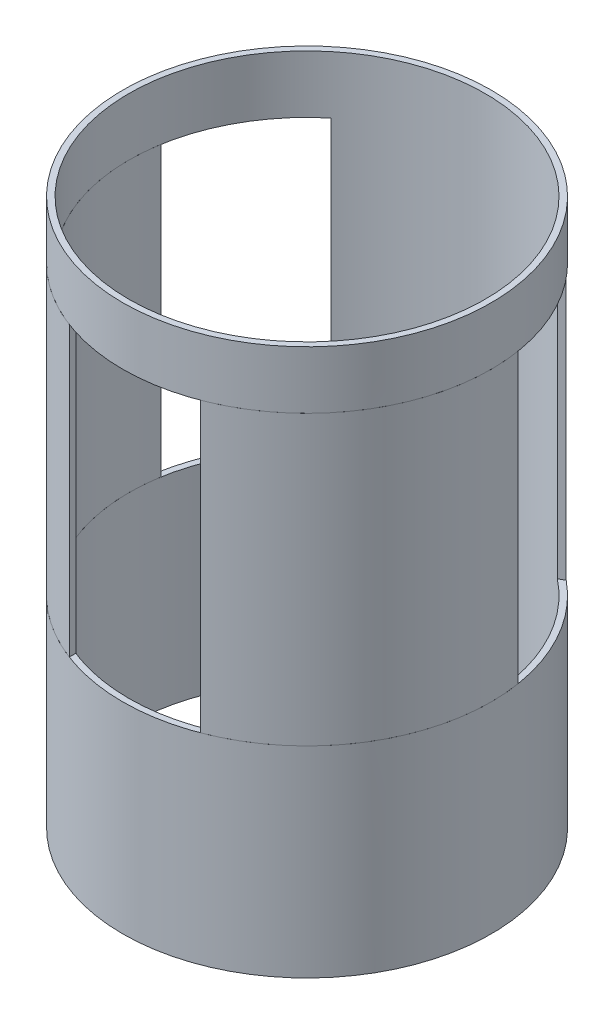
ISO-10303-21;
HEADER;
FILE_DESCRIPTION(('STEP AP214'),'2;1');
FILE_NAME('part.step','',(''),(''),'','','');
FILE_SCHEMA(('AUTOMOTIVE_DESIGN { 1 0 10303 214 1 1 1 1 }'));
ENDSEC;
DATA;
#1=APPLICATION_CONTEXT('core data for automotive mechanical design processes');
#2=APPLICATION_PROTOCOL_DEFINITION('international standard','automotive_design',2000,#1);
#3=PRODUCT_CONTEXT('',#1,'mechanical');
#4=PRODUCT('Part','Part','',(#3));
#5=PRODUCT_RELATED_PRODUCT_CATEGORY('part','',(#4));
#6=PRODUCT_DEFINITION_FORMATION('','',#4);
#7=PRODUCT_DEFINITION_CONTEXT('part definition',#1,'design');
#8=PRODUCT_DEFINITION('design','',#6,#7);
#9=PRODUCT_DEFINITION_SHAPE('','',#8);
#10=(LENGTH_UNIT() NAMED_UNIT(*) SI_UNIT(.MILLI.,.METRE.));
#11=(NAMED_UNIT(*) PLANE_ANGLE_UNIT() SI_UNIT($,.RADIAN.));
#12=(NAMED_UNIT(*) SI_UNIT($,.STERADIAN.) SOLID_ANGLE_UNIT());
#13=UNCERTAINTY_MEASURE_WITH_UNIT(LENGTH_MEASURE(1.E-05),#10,'distance_accuracy_value','');
#14=(GEOMETRIC_REPRESENTATION_CONTEXT(3) GLOBAL_UNCERTAINTY_ASSIGNED_CONTEXT((#13)) GLOBAL_UNIT_ASSIGNED_CONTEXT((#10,
#11,#12)) REPRESENTATION_CONTEXT('',''));
#15=CARTESIAN_POINT('',(0.,0.,0.));
#16=DIRECTION('',(0.,0.,1.));
#17=DIRECTION('',(1.,0.,0.));
#18=AXIS2_PLACEMENT_3D('',#15,#16,#17);
#19=CARTESIAN_POINT('',(0.,107.5,0.));
#20=DIRECTION('',(0.,-1.,0.));
#21=DIRECTION('',(0.,0.,-1.));
#22=AXIS2_PLACEMENT_3D('',#19,#20,#21);
#23=CYLINDRICAL_SURFACE('',#22,66.5);
#24=CARTESIAN_POINT('',(0.,0.,0.));
#25=DIRECTION('',(0.,1.,0.));
#26=DIRECTION('',(0.,0.,1.));
#27=AXIS2_PLACEMENT_3D('',#24,#25,#26);
#28=CIRCLE('',#27,66.5);
#29=CARTESIAN_POINT('',(-65.5808484364172,0.,-11.0182720224032));
#30=VERTEX_POINT('',#29);
#31=CARTESIAN_POINT('',(-24.4719165694739,0.,61.8334480634608));
#32=VERTEX_POINT('',#31);
#33=EDGE_CURVE('E125',#30,#32,#28,.T.);
#34=ORIENTED_EDGE('',*,*,#33,.F.);
#35=DIRECTION('',(0.,-1.,0.));
#36=VECTOR('',#35,1.);
#37=CARTESIAN_POINT('',(-65.5808484364172,107.5,-11.0182720224032));
#38=LINE('',#37,#36);
#39=CARTESIAN_POINT('',(-65.5808484364172,107.5,-11.0182720224032));
#40=VERTEX_POINT('',#39);
#41=EDGE_CURVE('E13',#40,#30,#38,.T.);
#42=ORIENTED_EDGE('',*,*,#41,.F.);
#43=CARTESIAN_POINT('',(0.,107.5,0.));
#44=DIRECTION('',(0.,1.,0.));
#45=DIRECTION('',(0.,0.,1.));
#46=AXIS2_PLACEMENT_3D('',#43,#44,#45);
#47=CIRCLE('',#46,66.5);
#48=CARTESIAN_POINT('',(-24.4719165694739,107.5,61.8334480634608));
#49=VERTEX_POINT('',#48);
#50=EDGE_CURVE('E119',#40,#49,#47,.T.);
#51=ORIENTED_EDGE('',*,*,#50,.T.);
#52=DIRECTION('',(0.,-1.,0.));
#53=VECTOR('',#52,1.);
#54=CARTESIAN_POINT('',(-24.4719165694739,107.5,61.8334480634608));
#55=LINE('',#54,#53);
#56=EDGE_CURVE('E100',#49,#32,#55,.T.);
#57=ORIENTED_EDGE('',*,*,#56,.T.);
#58=EDGE_LOOP('',(#34,#42,#51,#57));
#59=FACE_BOUND('',#58,.T.);
#60=ADVANCED_FACE('F62',(#59),#23,.F.);
#61=CARTESIAN_POINT('',(0.,107.5,0.));
#62=DIRECTION('',(0.16568830108877,0.,-0.986178171976199));
#63=DIRECTION('',(-0.986178171976199,0.,-0.16568830108877));
#64=AXIS2_PLACEMENT_3D('',#61,#62,#63);
#65=PLANE('',#64);
#66=DIRECTION('',(0.986178171976199,0.,0.16568830108877));
#67=VECTOR('',#66,1.);
#68=CARTESIAN_POINT('',(0.,0.,0.));
#69=LINE('',#68,#67);
#70=CARTESIAN_POINT('',(-67.7997493233637,0.,-11.3910706998529));
#71=VERTEX_POINT('',#70);
#72=EDGE_CURVE('E113',#71,#30,#69,.T.);
#73=ORIENTED_EDGE('',*,*,#72,.F.);
#74=DIRECTION('',(0.,-1.,0.));
#75=VECTOR('',#74,1.);
#76=CARTESIAN_POINT('',(-67.7997493233637,107.5,-11.3910706998529));
#77=LINE('',#76,#75);
#78=CARTESIAN_POINT('',(-67.7997493233637,107.5,-11.3910706998529));
#79=VERTEX_POINT('',#78);
#80=EDGE_CURVE('E70',#79,#71,#77,.T.);
#81=ORIENTED_EDGE('',*,*,#80,.F.);
#82=DIRECTION('',(0.986178171976199,0.,0.16568830108877));
#83=VECTOR('',#82,1.);
#84=CARTESIAN_POINT('',(0.,107.5,0.));
#85=LINE('',#84,#83);
#86=EDGE_CURVE('E111',#79,#40,#85,.T.);
#87=ORIENTED_EDGE('',*,*,#86,.T.);
#88=ORIENTED_EDGE('',*,*,#41,.T.);
#89=EDGE_LOOP('',(#73,#81,#87,#88));
#90=FACE_BOUND('',#89,.T.);
#91=ADVANCED_FACE('F109',(#90),#65,.T.);
#92=CARTESIAN_POINT('',(0.,107.5,0.));
#93=DIRECTION('',(0.,-1.,0.));
#94=DIRECTION('',(0.,0.,-1.));
#95=AXIS2_PLACEMENT_3D('',#92,#93,#94);
#96=CYLINDRICAL_SURFACE('',#95,68.75);
#97=CARTESIAN_POINT('',(0.,0.,0.));
#98=DIRECTION('',(0.,1.,0.));
#99=DIRECTION('',(0.,0.,1.));
#100=AXIS2_PLACEMENT_3D('',#97,#98,#99);
#101=CIRCLE('',#100,68.75);
#102=CARTESIAN_POINT('',(-24.4719165694739,0.,64.2470839759806));
#103=VERTEX_POINT('',#102);
#104=EDGE_CURVE('E93',#71,#103,#101,.T.);
#105=ORIENTED_EDGE('',*,*,#104,.T.);
#106=DIRECTION('',(0.,-1.,0.));
#107=VECTOR('',#106,1.);
#108=CARTESIAN_POINT('',(-24.4719165694739,107.5,64.2470839759806));
#109=LINE('',#108,#107);
#110=CARTESIAN_POINT('',(-24.4719165694739,107.5,64.2470839759806));
#111=VERTEX_POINT('',#110);
#112=EDGE_CURVE('E114',#111,#103,#109,.T.);
#113=ORIENTED_EDGE('',*,*,#112,.F.);
#114=CARTESIAN_POINT('',(0.,107.5,0.));
#115=DIRECTION('',(0.,1.,0.));
#116=DIRECTION('',(0.,0.,1.));
#117=AXIS2_PLACEMENT_3D('',#114,#115,#116);
#118=CIRCLE('',#117,68.75);
#119=EDGE_CURVE('E115',#79,#111,#118,.T.);
#120=ORIENTED_EDGE('',*,*,#119,.F.);
#121=ORIENTED_EDGE('',*,*,#80,.T.);
#122=EDGE_LOOP('',(#105,#113,#120,#121));
#123=FACE_BOUND('',#122,.T.);
#124=ADVANCED_FACE('F116',(#123),#96,.T.);
#125=CARTESIAN_POINT('',(-24.4719165694739,107.5,0.));
#126=DIRECTION('',(-1.,0.,0.));
#127=DIRECTION('',(0.,0.,1.));
#128=AXIS2_PLACEMENT_3D('',#125,#126,#127);
#129=PLANE('',#128);
#130=DIRECTION('',(0.,0.,-1.));
#131=VECTOR('',#130,1.);
#132=CARTESIAN_POINT('',(-24.4719165694739,0.,0.));
#133=LINE('',#132,#131);
#134=EDGE_CURVE('E121',#103,#32,#133,.T.);
#135=ORIENTED_EDGE('',*,*,#134,.T.);
#136=ORIENTED_EDGE('',*,*,#56,.F.);
#137=DIRECTION('',(0.,0.,-1.));
#138=VECTOR('',#137,1.);
#139=CARTESIAN_POINT('',(-24.4719165694739,107.5,0.));
#140=LINE('',#139,#138);
#141=EDGE_CURVE('E78',#111,#49,#140,.T.);
#142=ORIENTED_EDGE('',*,*,#141,.F.);
#143=ORIENTED_EDGE('',*,*,#112,.T.);
#144=EDGE_LOOP('',(#135,#136,#142,#143));
#145=FACE_BOUND('',#144,.T.);
#146=ADVANCED_FACE('F134',(#145),#129,.F.);
#147=CARTESIAN_POINT('',(0.,107.5,0.));
#148=DIRECTION('',(0.,1.,0.));
#149=DIRECTION('',(0.,0.,1.));
#150=AXIS2_PLACEMENT_3D('',#147,#148,#149);
#151=PLANE('',#150);
#152=ORIENTED_EDGE('',*,*,#50,.F.);
#153=ORIENTED_EDGE('',*,*,#86,.F.);
#154=ORIENTED_EDGE('',*,*,#119,.T.);
#155=ORIENTED_EDGE('',*,*,#141,.T.);
#156=EDGE_LOOP('',(#152,#153,#154,#155));
#157=FACE_BOUND('',#156,.T.);
#158=ADVANCED_FACE('F118',(#157),#151,.T.);
#159=CARTESIAN_POINT('',(0.,0.,0.));
#160=DIRECTION('',(0.,1.,0.));
#161=DIRECTION('',(0.,0.,1.));
#162=AXIS2_PLACEMENT_3D('',#159,#160,#161);
#163=PLANE('',#162);
#164=ORIENTED_EDGE('',*,*,#33,.T.);
#165=ORIENTED_EDGE('',*,*,#134,.F.);
#166=ORIENTED_EDGE('',*,*,#104,.F.);
#167=ORIENTED_EDGE('',*,*,#72,.T.);
#168=EDGE_LOOP('',(#164,#165,#166,#167));
#169=FACE_BOUND('',#168,.T.);
#170=ADVANCED_FACE('F136',(#169),#163,.F.);
#171=CLOSED_SHELL('',(#60,#91,#124,#146,#158,#170));
#172=MANIFOLD_SOLID_BREP('B2',#171);
#173=CARTESIAN_POINT('',(0.,107.5,0.));
#174=DIRECTION('',(0.,-1.,0.));
#175=DIRECTION('',(0.,0.,-1.));
#176=AXIS2_PLACEMENT_3D('',#173,#174,#175);
#177=CYLINDRICAL_SURFACE('',#176,66.5);
#178=CARTESIAN_POINT('',(0.,0.,0.));
#179=DIRECTION('',(0.,1.,0.));
#180=DIRECTION('',(0.,0.,1.));
#181=AXIS2_PLACEMENT_3D('',#178,#179,#180);
#182=CIRCLE('',#181,66.5);
#183=CARTESIAN_POINT('',(24.4719165694739,0.,61.8334480634608));
#184=VERTEX_POINT('',#183);
#185=CARTESIAN_POINT('',(65.7852951112797,0.,-9.72342260327268));
#186=VERTEX_POINT('',#185);
#187=EDGE_CURVE('E276',#184,#186,#182,.T.);
#188=ORIENTED_EDGE('',*,*,#187,.F.);
#189=DIRECTION('',(0.,-1.,0.));
#190=VECTOR('',#189,1.);
#191=CARTESIAN_POINT('',(24.4719165694739,107.5,61.8334480634608));
#192=LINE('',#191,#190);
#193=CARTESIAN_POINT('',(24.4719165694739,107.5,61.8334480634608));
#194=VERTEX_POINT('',#193);
#195=EDGE_CURVE('E60',#194,#184,#192,.T.);
#196=ORIENTED_EDGE('',*,*,#195,.F.);
#197=CARTESIAN_POINT('',(0.,107.5,0.));
#198=DIRECTION('',(0.,1.,0.));
#199=DIRECTION('',(0.,0.,1.));
#200=AXIS2_PLACEMENT_3D('',#197,#198,#199);
#201=CIRCLE('',#200,66.5);
#202=CARTESIAN_POINT('',(65.7852951112797,107.5,-9.72342260327268));
#203=VERTEX_POINT('',#202);
#204=EDGE_CURVE('E270',#194,#203,#201,.T.);
#205=ORIENTED_EDGE('',*,*,#204,.T.);
#206=DIRECTION('',(0.,-1.,0.));
#207=VECTOR('',#206,1.);
#208=CARTESIAN_POINT('',(65.7852951112797,107.5,-9.72342260327268));
#209=LINE('',#208,#207);
#210=EDGE_CURVE('E251',#203,#186,#209,.T.);
#211=ORIENTED_EDGE('',*,*,#210,.T.);
#212=EDGE_LOOP('',(#188,#196,#205,#211));
#213=FACE_BOUND('',#212,.T.);
#214=ADVANCED_FACE('F213',(#213),#177,.F.);
#215=CARTESIAN_POINT('',(24.471916569474,107.5,0.));
#216=DIRECTION('',(-1.,0.,0.));
#217=DIRECTION('',(0.,0.,1.));
#218=AXIS2_PLACEMENT_3D('',#215,#216,#217);
#219=PLANE('',#218);
#220=DIRECTION('',(0.,0.,-1.));
#221=VECTOR('',#220,1.);
#222=CARTESIAN_POINT('',(24.471916569474,0.,0.));
#223=LINE('',#222,#221);
#224=CARTESIAN_POINT('',(24.4719165694739,0.,64.2470839759806));
#225=VERTEX_POINT('',#224);
#226=EDGE_CURVE('E264',#225,#184,#223,.T.);
#227=ORIENTED_EDGE('',*,*,#226,.F.);
#228=DIRECTION('',(0.,-1.,0.));
#229=VECTOR('',#228,1.);
#230=CARTESIAN_POINT('',(24.4719165694739,107.5,64.2470839759806));
#231=LINE('',#230,#229);
#232=CARTESIAN_POINT('',(24.4719165694739,107.5,64.2470839759806));
#233=VERTEX_POINT('',#232);
#234=EDGE_CURVE('E221',#233,#225,#231,.T.);
#235=ORIENTED_EDGE('',*,*,#234,.F.);
#236=DIRECTION('',(0.,0.,-1.));
#237=VECTOR('',#236,1.);
#238=CARTESIAN_POINT('',(24.471916569474,107.5,0.));
#239=LINE('',#238,#237);
#240=EDGE_CURVE('E262',#233,#194,#239,.T.);
#241=ORIENTED_EDGE('',*,*,#240,.T.);
#242=ORIENTED_EDGE('',*,*,#195,.T.);
#243=EDGE_LOOP('',(#227,#235,#241,#242));
#244=FACE_BOUND('',#243,.T.);
#245=ADVANCED_FACE('F260',(#244),#219,.T.);
#246=CARTESIAN_POINT('',(0.,107.5,0.));
#247=DIRECTION('',(0.,-1.,0.));
#248=DIRECTION('',(0.,0.,-1.));
#249=AXIS2_PLACEMENT_3D('',#246,#247,#248);
#250=CYLINDRICAL_SURFACE('',#249,68.75);
#251=CARTESIAN_POINT('',(0.,0.,0.));
#252=DIRECTION('',(0.,1.,0.));
#253=DIRECTION('',(0.,0.,1.));
#254=AXIS2_PLACEMENT_3D('',#251,#252,#253);
#255=CIRCLE('',#254,68.75);
#256=CARTESIAN_POINT('',(67.8755651270083,0.,-10.9302405595325));
#257=VERTEX_POINT('',#256);
#258=EDGE_CURVE('E244',#225,#257,#255,.T.);
#259=ORIENTED_EDGE('',*,*,#258,.T.);
#260=DIRECTION('',(0.,-1.,0.));
#261=VECTOR('',#260,1.);
#262=CARTESIAN_POINT('',(67.8755651270083,107.5,-10.9302405595325));
#263=LINE('',#262,#261);
#264=CARTESIAN_POINT('',(67.8755651270083,107.5,-10.9302405595325));
#265=VERTEX_POINT('',#264);
#266=EDGE_CURVE('E265',#265,#257,#263,.T.);
#267=ORIENTED_EDGE('',*,*,#266,.F.);
#268=CARTESIAN_POINT('',(0.,107.5,0.));
#269=DIRECTION('',(0.,1.,0.));
#270=DIRECTION('',(0.,0.,1.));
#271=AXIS2_PLACEMENT_3D('',#268,#269,#270);
#272=CIRCLE('',#271,68.75);
#273=EDGE_CURVE('E266',#233,#265,#272,.T.);
#274=ORIENTED_EDGE('',*,*,#273,.F.);
#275=ORIENTED_EDGE('',*,*,#234,.T.);
#276=EDGE_LOOP('',(#259,#267,#274,#275));
#277=FACE_BOUND('',#276,.T.);
#278=ADVANCED_FACE('F267',(#277),#250,.T.);
#279=CARTESIAN_POINT('',(12.235958284737,107.5,21.1933014284577));
#280=DIRECTION('',(0.5,0.,0.866025403784439));
#281=DIRECTION('',(0.866025403784439,0.,-0.5));
#282=AXIS2_PLACEMENT_3D('',#279,#280,#281);
#283=PLANE('',#282);
#284=DIRECTION('',(-0.866025403784439,0.,0.5));
#285=VECTOR('',#284,1.);
#286=CARTESIAN_POINT('',(12.235958284737,0.,21.1933014284577));
#287=LINE('',#286,#285);
#288=EDGE_CURVE('E272',#257,#186,#287,.T.);
#289=ORIENTED_EDGE('',*,*,#288,.T.);
#290=ORIENTED_EDGE('',*,*,#210,.F.);
#291=DIRECTION('',(-0.866025403784439,0.,0.5));
#292=VECTOR('',#291,1.);
#293=CARTESIAN_POINT('',(12.235958284737,107.5,21.1933014284577));
#294=LINE('',#293,#292);
#295=EDGE_CURVE('E229',#265,#203,#294,.T.);
#296=ORIENTED_EDGE('',*,*,#295,.F.);
#297=ORIENTED_EDGE('',*,*,#266,.T.);
#298=EDGE_LOOP('',(#289,#290,#296,#297));
#299=FACE_BOUND('',#298,.T.);
#300=ADVANCED_FACE('F285',(#299),#283,.F.);
#301=CARTESIAN_POINT('',(0.,107.5,0.));
#302=DIRECTION('',(0.,1.,0.));
#303=DIRECTION('',(0.,0.,1.));
#304=AXIS2_PLACEMENT_3D('',#301,#302,#303);
#305=PLANE('',#304);
#306=ORIENTED_EDGE('',*,*,#204,.F.);
#307=ORIENTED_EDGE('',*,*,#240,.F.);
#308=ORIENTED_EDGE('',*,*,#273,.T.);
#309=ORIENTED_EDGE('',*,*,#295,.T.);
#310=EDGE_LOOP('',(#306,#307,#308,#309));
#311=FACE_BOUND('',#310,.T.);
#312=ADVANCED_FACE('F269',(#311),#305,.T.);
#313=CARTESIAN_POINT('',(0.,0.,0.));
#314=DIRECTION('',(0.,1.,0.));
#315=DIRECTION('',(0.,0.,1.));
#316=AXIS2_PLACEMENT_3D('',#313,#314,#315);
#317=PLANE('',#316);
#318=ORIENTED_EDGE('',*,*,#187,.T.);
#319=ORIENTED_EDGE('',*,*,#288,.F.);
#320=ORIENTED_EDGE('',*,*,#258,.F.);
#321=ORIENTED_EDGE('',*,*,#226,.T.);
#322=EDGE_LOOP('',(#318,#319,#320,#321));
#323=FACE_BOUND('',#322,.T.);
#324=ADVANCED_FACE('F287',(#323),#317,.F.);
#325=CLOSED_SHELL('',(#214,#245,#278,#300,#312,#324));
#326=MANIFOLD_SOLID_BREP('B7',#325);
#327=CARTESIAN_POINT('',(0.,107.5,0.));
#328=DIRECTION('',(0.,-1.,0.));
#329=DIRECTION('',(0.,0.,-1.));
#330=AXIS2_PLACEMENT_3D('',#327,#328,#329);
#331=CYLINDRICAL_SURFACE('',#330,66.5);
#332=DIRECTION('',(0.,-1.,0.));
#333=VECTOR('',#332,1.);
#334=CARTESIAN_POINT('',(-42.332527695417,107.5,-51.2855447364728));
#335=LINE('',#334,#333);
#336=CARTESIAN_POINT('',(-42.332527695417,107.5,-51.2855447364728));
#337=VERTEX_POINT('',#336);
#338=CARTESIAN_POINT('',(-42.332527695417,0.,-51.2855447364728));
#339=VERTEX_POINT('',#338);
#340=EDGE_CURVE('E385',#337,#339,#335,.T.);
#341=ORIENTED_EDGE('',*,*,#340,.T.);
#342=CARTESIAN_POINT('',(0.,0.,0.));
#343=DIRECTION('',(0.,1.,0.));
#344=DIRECTION('',(0.,0.,1.));
#345=AXIS2_PLACEMENT_3D('',#342,#343,#344);
#346=CIRCLE('',#345,66.5);
#347=CARTESIAN_POINT('',(41.3133785418058,0.,-52.1100254601882));
#348=VERTEX_POINT('',#347);
#349=EDGE_CURVE('E403',#339,#348,#346,.T.);
#350=ORIENTED_EDGE('',*,*,#349,.T.);
#351=DIRECTION('',(0.,-1.,0.));
#352=VECTOR('',#351,1.);
#353=CARTESIAN_POINT('',(41.3133785418058,107.5,-52.1100254601882));
#354=LINE('',#353,#352);
#355=CARTESIAN_POINT('',(41.3133785418058,107.5,-52.1100254601882));
#356=VERTEX_POINT('',#355);
#357=EDGE_CURVE('E211',#356,#348,#354,.T.);
#358=ORIENTED_EDGE('',*,*,#357,.F.);
#359=CARTESIAN_POINT('',(0.,107.5,0.));
#360=DIRECTION('',(0.,1.,0.));
#361=DIRECTION('',(0.,0.,1.));
#362=AXIS2_PLACEMENT_3D('',#359,#360,#361);
#363=CIRCLE('',#362,66.5);
#364=EDGE_CURVE('E426',#337,#356,#363,.T.);
#365=ORIENTED_EDGE('',*,*,#364,.F.);
#366=EDGE_LOOP('',(#341,#350,#358,#365));
#367=FACE_BOUND('',#366,.T.);
#368=CARTESIAN_POINT('',(0.,129.,0.));
#369=DIRECTION('',(0.,1.,0.));
#370=DIRECTION('',(0.,0.,1.));
#371=AXIS2_PLACEMENT_3D('',#368,#369,#370);
#372=CIRCLE('',#371,66.5);
#373=CARTESIAN_POINT('',(0.,129.,66.5));
#374=VERTEX_POINT('',#373);
#375=EDGE_CURVE('E421',#374,#374,#372,.T.);
#376=ORIENTED_EDGE('',*,*,#375,.T.);
#377=EDGE_LOOP('',(#376));
#378=FACE_BOUND('',#377,.T.);
#379=CARTESIAN_POINT('',(0.,-75.,0.));
#380=DIRECTION('',(0.,1.,0.));
#381=DIRECTION('',(0.,0.,1.));
#382=AXIS2_PLACEMENT_3D('',#379,#380,#381);
#383=CIRCLE('',#382,66.5);
#384=CARTESIAN_POINT('',(0.,-75.,66.5));
#385=VERTEX_POINT('',#384);
#386=EDGE_CURVE('E416',#385,#385,#383,.T.);
#387=ORIENTED_EDGE('',*,*,#386,.F.);
#388=EDGE_LOOP('',(#387));
#389=FACE_BOUND('',#388,.T.);
#390=ADVANCED_FACE('F349',(#367,#378,#389),#331,.F.);
#391=CARTESIAN_POINT('',(-12.235958284737,107.5,-21.1933014284577));
#392=DIRECTION('',(0.500000000000001,0.,0.866025403784438));
#393=DIRECTION('',(0.866025403784438,0.,-0.500000000000001));
#394=AXIS2_PLACEMENT_3D('',#391,#392,#393);
#395=PLANE('',#394);
#396=DIRECTION('',(-0.866025403784438,0.,0.500000000000001));
#397=VECTOR('',#396,1.);
#398=CARTESIAN_POINT('',(-12.235958284737,0.,-21.1933014284577));
#399=LINE('',#398,#397);
#400=CARTESIAN_POINT('',(43.4036485575344,0.,-53.3168434164481));
#401=VERTEX_POINT('',#400);
#402=EDGE_CURVE('E395',#401,#348,#399,.T.);
#403=ORIENTED_EDGE('',*,*,#402,.F.);
#404=DIRECTION('',(0.,-1.,0.));
#405=VECTOR('',#404,1.);
#406=CARTESIAN_POINT('',(43.4036485575344,107.5,-53.3168434164481));
#407=LINE('',#406,#405);
#408=CARTESIAN_POINT('',(43.4036485575344,107.5,-53.3168434164481));
#409=VERTEX_POINT('',#408);
#410=EDGE_CURVE('E358',#409,#401,#407,.T.);
#411=ORIENTED_EDGE('',*,*,#410,.F.);
#412=DIRECTION('',(-0.866025403784438,0.,0.500000000000001));
#413=VECTOR('',#412,1.);
#414=CARTESIAN_POINT('',(-12.235958284737,107.5,-21.1933014284577));
#415=LINE('',#414,#413);
#416=EDGE_CURVE('E398',#409,#356,#415,.T.);
#417=ORIENTED_EDGE('',*,*,#416,.T.);
#418=ORIENTED_EDGE('',*,*,#357,.T.);
#419=EDGE_LOOP('',(#403,#411,#417,#418));
#420=FACE_BOUND('',#419,.T.);
#421=ADVANCED_FACE('F394',(#420),#395,.T.);
#422=CARTESIAN_POINT('',(0.,107.5,0.));
#423=DIRECTION('',(0.,-1.,0.));
#424=DIRECTION('',(0.,0.,-1.));
#425=AXIS2_PLACEMENT_3D('',#422,#423,#424);
#426=CYLINDRICAL_SURFACE('',#425,68.75);
#427=ORIENTED_EDGE('',*,*,#410,.T.);
#428=CARTESIAN_POINT('',(0.,0.,0.));
#429=DIRECTION('',(0.,1.,0.));
#430=DIRECTION('',(0.,0.,1.));
#431=AXIS2_PLACEMENT_3D('',#428,#429,#430);
#432=CIRCLE('',#431,68.75);
#433=CARTESIAN_POINT('',(-43.7648312640589,0.,-53.0207699343234));
#434=VERTEX_POINT('',#433);
#435=EDGE_CURVE('E404',#434,#401,#432,.T.);
#436=ORIENTED_EDGE('',*,*,#435,.F.);
#437=DIRECTION('',(0.,-1.,0.));
#438=VECTOR('',#437,1.);
#439=CARTESIAN_POINT('',(-43.7648312640589,107.5,-53.0207699343234));
#440=LINE('',#439,#438);
#441=CARTESIAN_POINT('',(-43.7648312640589,107.5,-53.0207699343234));
#442=VERTEX_POINT('',#441);
#443=EDGE_CURVE('E366',#442,#434,#440,.T.);
#444=ORIENTED_EDGE('',*,*,#443,.F.);
#445=CARTESIAN_POINT('',(0.,107.5,0.));
#446=DIRECTION('',(0.,1.,0.));
#447=DIRECTION('',(0.,0.,1.));
#448=AXIS2_PLACEMENT_3D('',#445,#446,#447);
#449=CIRCLE('',#448,68.75);
#450=EDGE_CURVE('E425',#442,#409,#449,.T.);
#451=ORIENTED_EDGE('',*,*,#450,.T.);
#452=EDGE_LOOP('',(#427,#436,#444,#451));
#453=FACE_BOUND('',#452,.T.);
#454=CARTESIAN_POINT('',(0.,129.,0.));
#455=DIRECTION('',(0.,1.,0.));
#456=DIRECTION('',(0.,0.,1.));
#457=AXIS2_PLACEMENT_3D('',#454,#455,#456);
#458=CIRCLE('',#457,68.75);
#459=CARTESIAN_POINT('',(0.,129.,68.75));
#460=VERTEX_POINT('',#459);
#461=EDGE_CURVE('E407',#460,#460,#458,.T.);
#462=ORIENTED_EDGE('',*,*,#461,.F.);
#463=EDGE_LOOP('',(#462));
#464=FACE_BOUND('',#463,.T.);
#465=CARTESIAN_POINT('',(0.,-75.,0.));
#466=DIRECTION('',(0.,1.,0.));
#467=DIRECTION('',(0.,0.,1.));
#468=AXIS2_PLACEMENT_3D('',#465,#466,#467);
#469=CIRCLE('',#468,68.75);
#470=CARTESIAN_POINT('',(0.,-75.,68.75));
#471=VERTEX_POINT('',#470);
#472=EDGE_CURVE('E411',#471,#471,#469,.T.);
#473=ORIENTED_EDGE('',*,*,#472,.T.);
#474=EDGE_LOOP('',(#473));
#475=FACE_BOUND('',#474,.T.);
#476=ADVANCED_FACE('F446',(#453,#464,#475),#426,.T.);
#477=CARTESIAN_POINT('',(0.,107.5,0.));
#478=DIRECTION('',(0.771211199044705,0.,-0.636579363840856));
#479=DIRECTION('',(-0.636579363840856,0.,-0.771211199044705));
#480=AXIS2_PLACEMENT_3D('',#477,#478,#479);
#481=PLANE('',#480);
#482=DIRECTION('',(0.636579363840856,0.,0.771211199044705));
#483=VECTOR('',#482,1.);
#484=CARTESIAN_POINT('',(0.,0.,0.));
#485=LINE('',#484,#483);
#486=EDGE_CURVE('E406',#434,#339,#485,.T.);
#487=ORIENTED_EDGE('',*,*,#486,.T.);
#488=ORIENTED_EDGE('',*,*,#340,.F.);
#489=DIRECTION('',(0.636579363840856,0.,0.771211199044705));
#490=VECTOR('',#489,1.);
#491=CARTESIAN_POINT('',(0.,107.5,0.));
#492=LINE('',#491,#490);
#493=EDGE_CURVE('E436',#442,#337,#492,.T.);
#494=ORIENTED_EDGE('',*,*,#493,.F.);
#495=ORIENTED_EDGE('',*,*,#443,.T.);
#496=EDGE_LOOP('',(#487,#488,#494,#495));
#497=FACE_BOUND('',#496,.T.);
#498=ADVANCED_FACE('F451',(#497),#481,.F.);
#499=CARTESIAN_POINT('',(0.,129.,0.));
#500=DIRECTION('',(0.,1.,0.));
#501=DIRECTION('',(0.,0.,1.));
#502=AXIS2_PLACEMENT_3D('',#499,#500,#501);
#503=PLANE('',#502);
#504=ORIENTED_EDGE('',*,*,#461,.T.);
#505=EDGE_LOOP('',(#504));
#506=FACE_BOUND('',#505,.T.);
#507=ORIENTED_EDGE('',*,*,#375,.F.);
#508=EDGE_LOOP('',(#507));
#509=FACE_BOUND('',#508,.T.);
#510=ADVANCED_FACE('F453',(#506,#509),#503,.T.);
#511=CARTESIAN_POINT('',(0.,107.5,0.));
#512=DIRECTION('',(0.,1.,0.));
#513=DIRECTION('',(0.,0.,1.));
#514=AXIS2_PLACEMENT_3D('',#511,#512,#513);
#515=PLANE('',#514);
#516=ORIENTED_EDGE('',*,*,#416,.F.);
#517=ORIENTED_EDGE('',*,*,#450,.F.);
#518=ORIENTED_EDGE('',*,*,#493,.T.);
#519=ORIENTED_EDGE('',*,*,#364,.T.);
#520=EDGE_LOOP('',(#516,#517,#518,#519));
#521=FACE_BOUND('',#520,.T.);
#522=ADVANCED_FACE('F450',(#521),#515,.F.);
#523=CARTESIAN_POINT('',(0.,0.,0.));
#524=DIRECTION('',(0.,1.,0.));
#525=DIRECTION('',(0.,0.,1.));
#526=AXIS2_PLACEMENT_3D('',#523,#524,#525);
#527=PLANE('',#526);
#528=ORIENTED_EDGE('',*,*,#486,.F.);
#529=ORIENTED_EDGE('',*,*,#435,.T.);
#530=ORIENTED_EDGE('',*,*,#402,.T.);
#531=ORIENTED_EDGE('',*,*,#349,.F.);
#532=EDGE_LOOP('',(#528,#529,#530,#531));
#533=FACE_BOUND('',#532,.T.);
#534=ADVANCED_FACE('F402',(#533),#527,.T.);
#535=CARTESIAN_POINT('',(0.,-75.,0.));
#536=DIRECTION('',(0.,1.,0.));
#537=DIRECTION('',(0.,0.,1.));
#538=AXIS2_PLACEMENT_3D('',#535,#536,#537);
#539=PLANE('',#538);
#540=ORIENTED_EDGE('',*,*,#472,.F.);
#541=EDGE_LOOP('',(#540));
#542=FACE_BOUND('',#541,.T.);
#543=ORIENTED_EDGE('',*,*,#386,.T.);
#544=EDGE_LOOP('',(#543));
#545=FACE_BOUND('',#544,.T.);
#546=ADVANCED_FACE('F492',(#542,#545),#539,.F.);
#547=CLOSED_SHELL('',(#390,#421,#476,#498,#510,#522,#534,#546));
#548=MANIFOLD_SOLID_BREP('B54',#547);
#549=ADVANCED_BREP_SHAPE_REPRESENTATION('',(#18,#172,#326,#548),#14);
#550=SHAPE_DEFINITION_REPRESENTATION(#9,#549);
ENDSEC;
END-ISO-10303-21;
